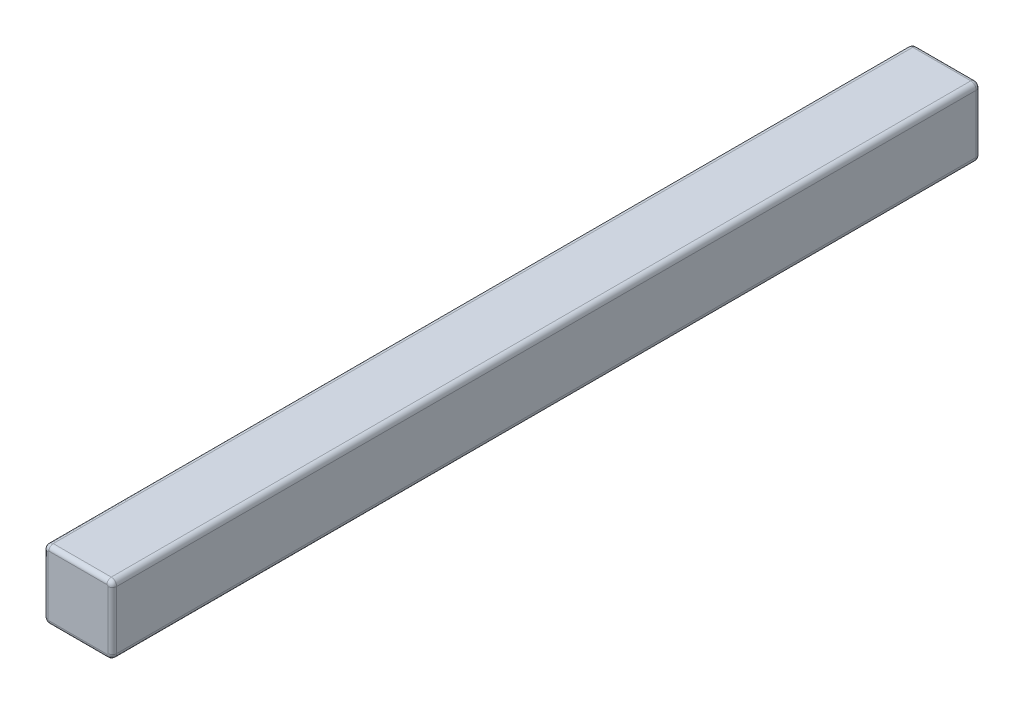
ISO-10303-21;
HEADER;
FILE_DESCRIPTION(('STEP AP214'),'2;1');
FILE_NAME('part.step','',(''),(''),'','','');
FILE_SCHEMA(('AUTOMOTIVE_DESIGN { 1 0 10303 214 1 1 1 1 }'));
ENDSEC;
DATA;
#1=APPLICATION_CONTEXT('core data for automotive mechanical design processes');
#2=APPLICATION_PROTOCOL_DEFINITION('international standard','automotive_design',2000,#1);
#3=PRODUCT_CONTEXT('',#1,'mechanical');
#4=PRODUCT('Part','Part','',(#3));
#5=PRODUCT_RELATED_PRODUCT_CATEGORY('part','',(#4));
#6=PRODUCT_DEFINITION_FORMATION('','',#4);
#7=PRODUCT_DEFINITION_CONTEXT('part definition',#1,'design');
#8=PRODUCT_DEFINITION('design','',#6,#7);
#9=PRODUCT_DEFINITION_SHAPE('','',#8);
#10=(LENGTH_UNIT() NAMED_UNIT(*) SI_UNIT(.MILLI.,.METRE.));
#11=(NAMED_UNIT(*) PLANE_ANGLE_UNIT() SI_UNIT($,.RADIAN.));
#12=(NAMED_UNIT(*) SI_UNIT($,.STERADIAN.) SOLID_ANGLE_UNIT());
#13=UNCERTAINTY_MEASURE_WITH_UNIT(LENGTH_MEASURE(1.E-05),#10,'distance_accuracy_value','');
#14=(GEOMETRIC_REPRESENTATION_CONTEXT(3) GLOBAL_UNCERTAINTY_ASSIGNED_CONTEXT((#13)) GLOBAL_UNIT_ASSIGNED_CONTEXT((#10,
#11,#12)) REPRESENTATION_CONTEXT('',''));
#15=CARTESIAN_POINT('',(0.,0.,0.));
#16=DIRECTION('',(0.,0.,1.));
#17=DIRECTION('',(1.,0.,0.));
#18=AXIS2_PLACEMENT_3D('',#15,#16,#17);
#19=CARTESIAN_POINT('',(-1.3375,1.3375,40.));
#20=DIRECTION('',(0.,0.,-1.));
#21=DIRECTION('',(-1.,0.,0.));
#22=AXIS2_PLACEMENT_3D('',#19,#20,#21);
#23=CYLINDRICAL_SURFACE('',#22,0.25);
#24=DIRECTION('',(0.,0.,-1.));
#25=VECTOR('',#24,1.);
#26=CARTESIAN_POINT('',(-1.3375,1.5875,40.));
#27=LINE('',#26,#25);
#28=CARTESIAN_POINT('',(-1.3375,1.5875,39.8));
#29=VERTEX_POINT('',#28);
#30=CARTESIAN_POINT('',(-1.3375,1.5875,0.199999999999999));
#31=VERTEX_POINT('',#30);
#32=EDGE_CURVE('E267',#29,#31,#27,.T.);
#33=ORIENTED_EDGE('',*,*,#32,.T.);
#34=CARTESIAN_POINT('',(-1.3375,1.3375,0.199999999999999));
#35=DIRECTION('',(0.,0.,1.));
#36=DIRECTION('',(1.,0.,0.));
#37=AXIS2_PLACEMENT_3D('',#34,#35,#36);
#38=CIRCLE('',#37,0.25);
#39=CARTESIAN_POINT('',(-1.5875,1.3375,0.199999999999999));
#40=VERTEX_POINT('',#39);
#41=EDGE_CURVE('E232',#31,#40,#38,.T.);
#42=ORIENTED_EDGE('',*,*,#41,.T.);
#43=DIRECTION('',(0.,0.,-1.));
#44=VECTOR('',#43,1.);
#45=CARTESIAN_POINT('',(-1.5875,1.3375,40.));
#46=LINE('',#45,#44);
#47=CARTESIAN_POINT('',(-1.5875,1.3375,39.8));
#48=VERTEX_POINT('',#47);
#49=EDGE_CURVE('E171',#48,#40,#46,.T.);
#50=ORIENTED_EDGE('',*,*,#49,.F.);
#51=CARTESIAN_POINT('',(-1.3375,1.3375,39.8));
#52=DIRECTION('',(0.,0.,1.));
#53=DIRECTION('',(1.,0.,0.));
#54=AXIS2_PLACEMENT_3D('',#51,#52,#53);
#55=CIRCLE('',#54,0.25);
#56=EDGE_CURVE('E230',#48,#29,#55,.F.);
#57=ORIENTED_EDGE('',*,*,#56,.T.);
#58=EDGE_LOOP('',(#33,#42,#50,#57));
#59=FACE_BOUND('',#58,.T.);
#60=ADVANCED_FACE('F35',(#59),#23,.T.);
#61=CARTESIAN_POINT('',(-1.5875,1.3375,40.));
#62=DIRECTION('',(1.,0.,0.));
#63=DIRECTION('',(0.,0.,-1.));
#64=AXIS2_PLACEMENT_3D('',#61,#62,#63);
#65=PLANE('',#64);
#66=ORIENTED_EDGE('',*,*,#49,.T.);
#67=DIRECTION('',(0.,-1.,0.));
#68=VECTOR('',#67,1.);
#69=CARTESIAN_POINT('',(-1.5875,1.3375,0.199999999999999));
#70=LINE('',#69,#68);
#71=CARTESIAN_POINT('',(-1.5875,-1.3375,0.199999999999999));
#72=VERTEX_POINT('',#71);
#73=EDGE_CURVE('E170',#40,#72,#70,.T.);
#74=ORIENTED_EDGE('',*,*,#73,.T.);
#75=DIRECTION('',(0.,0.,-1.));
#76=VECTOR('',#75,1.);
#77=CARTESIAN_POINT('',(-1.5875,-1.3375,40.));
#78=LINE('',#77,#76);
#79=CARTESIAN_POINT('',(-1.5875,-1.3375,39.8));
#80=VERTEX_POINT('',#79);
#81=EDGE_CURVE('E152',#80,#72,#78,.T.);
#82=ORIENTED_EDGE('',*,*,#81,.F.);
#83=DIRECTION('',(0.,-1.,0.));
#84=VECTOR('',#83,1.);
#85=CARTESIAN_POINT('',(-1.5875,1.3375,39.8));
#86=LINE('',#85,#84);
#87=EDGE_CURVE('E167',#80,#48,#86,.F.);
#88=ORIENTED_EDGE('',*,*,#87,.T.);
#89=EDGE_LOOP('',(#66,#74,#82,#88));
#90=FACE_BOUND('',#89,.T.);
#91=ADVANCED_FACE('F165',(#90),#65,.F.);
#92=CARTESIAN_POINT('',(-1.3375,-1.3375,40.));
#93=DIRECTION('',(0.,0.,-1.));
#94=DIRECTION('',(-1.,0.,0.));
#95=AXIS2_PLACEMENT_3D('',#92,#93,#94);
#96=CYLINDRICAL_SURFACE('',#95,0.25);
#97=ORIENTED_EDGE('',*,*,#81,.T.);
#98=CARTESIAN_POINT('',(-1.3375,-1.3375,0.199999999999999));
#99=DIRECTION('',(0.,0.,1.));
#100=DIRECTION('',(1.,0.,0.));
#101=AXIS2_PLACEMENT_3D('',#98,#99,#100);
#102=CIRCLE('',#101,0.25);
#103=CARTESIAN_POINT('',(-1.3375,-1.5875,0.199999999999999));
#104=VERTEX_POINT('',#103);
#105=EDGE_CURVE('E159',#72,#104,#102,.T.);
#106=ORIENTED_EDGE('',*,*,#105,.T.);
#107=DIRECTION('',(0.,0.,-1.));
#108=VECTOR('',#107,1.);
#109=CARTESIAN_POINT('',(-1.3375,-1.5875,40.));
#110=LINE('',#109,#108);
#111=CARTESIAN_POINT('',(-1.3375,-1.5875,39.8));
#112=VERTEX_POINT('',#111);
#113=EDGE_CURVE('E154',#112,#104,#110,.T.);
#114=ORIENTED_EDGE('',*,*,#113,.F.);
#115=CARTESIAN_POINT('',(-1.3375,-1.3375,39.8));
#116=DIRECTION('',(0.,0.,1.));
#117=DIRECTION('',(1.,0.,0.));
#118=AXIS2_PLACEMENT_3D('',#115,#116,#117);
#119=CIRCLE('',#118,0.25);
#120=EDGE_CURVE('E149',#112,#80,#119,.F.);
#121=ORIENTED_EDGE('',*,*,#120,.T.);
#122=EDGE_LOOP('',(#97,#106,#114,#121));
#123=FACE_BOUND('',#122,.T.);
#124=ADVANCED_FACE('F151',(#123),#96,.T.);
#125=CARTESIAN_POINT('',(-1.3375,-1.5875,40.));
#126=DIRECTION('',(0.,1.,0.));
#127=DIRECTION('',(-1.,0.,0.));
#128=AXIS2_PLACEMENT_3D('',#125,#126,#127);
#129=PLANE('',#128);
#130=ORIENTED_EDGE('',*,*,#113,.T.);
#131=DIRECTION('',(1.,0.,0.));
#132=VECTOR('',#131,1.);
#133=CARTESIAN_POINT('',(-1.3375,-1.5875,0.199999999999999));
#134=LINE('',#133,#132);
#135=CARTESIAN_POINT('',(1.3375,-1.5875,0.199999999999999));
#136=VERTEX_POINT('',#135);
#137=EDGE_CURVE('E211',#104,#136,#134,.T.);
#138=ORIENTED_EDGE('',*,*,#137,.T.);
#139=DIRECTION('',(0.,0.,-1.));
#140=VECTOR('',#139,1.);
#141=CARTESIAN_POINT('',(1.3375,-1.5875,40.));
#142=LINE('',#141,#140);
#143=CARTESIAN_POINT('',(1.3375,-1.5875,39.8));
#144=VERTEX_POINT('',#143);
#145=EDGE_CURVE('E311',#144,#136,#142,.T.);
#146=ORIENTED_EDGE('',*,*,#145,.F.);
#147=DIRECTION('',(1.,0.,0.));
#148=VECTOR('',#147,1.);
#149=CARTESIAN_POINT('',(-1.3375,-1.5875,39.8));
#150=LINE('',#149,#148);
#151=EDGE_CURVE('E209',#144,#112,#150,.F.);
#152=ORIENTED_EDGE('',*,*,#151,.T.);
#153=EDGE_LOOP('',(#130,#138,#146,#152));
#154=FACE_BOUND('',#153,.T.);
#155=ADVANCED_FACE('F316',(#154),#129,.F.);
#156=CARTESIAN_POINT('',(1.3375,-1.3375,40.));
#157=DIRECTION('',(0.,0.,-1.));
#158=DIRECTION('',(-1.,0.,0.));
#159=AXIS2_PLACEMENT_3D('',#156,#157,#158);
#160=CYLINDRICAL_SURFACE('',#159,0.25);
#161=ORIENTED_EDGE('',*,*,#145,.T.);
#162=CARTESIAN_POINT('',(1.3375,-1.3375,0.199999999999999));
#163=DIRECTION('',(0.,0.,1.));
#164=DIRECTION('',(1.,0.,0.));
#165=AXIS2_PLACEMENT_3D('',#162,#163,#164);
#166=CIRCLE('',#165,0.25);
#167=CARTESIAN_POINT('',(1.5875,-1.3375,0.199999999999999));
#168=VERTEX_POINT('',#167);
#169=EDGE_CURVE('E215',#136,#168,#166,.T.);
#170=ORIENTED_EDGE('',*,*,#169,.T.);
#171=DIRECTION('',(0.,0.,-1.));
#172=VECTOR('',#171,1.);
#173=CARTESIAN_POINT('',(1.5875,-1.3375,40.));
#174=LINE('',#173,#172);
#175=CARTESIAN_POINT('',(1.5875,-1.3375,39.8));
#176=VERTEX_POINT('',#175);
#177=EDGE_CURVE('E308',#176,#168,#174,.T.);
#178=ORIENTED_EDGE('',*,*,#177,.F.);
#179=CARTESIAN_POINT('',(1.3375,-1.3375,39.8));
#180=DIRECTION('',(0.,0.,1.));
#181=DIRECTION('',(1.,0.,0.));
#182=AXIS2_PLACEMENT_3D('',#179,#180,#181);
#183=CIRCLE('',#182,0.25);
#184=EDGE_CURVE('E213',#176,#144,#183,.F.);
#185=ORIENTED_EDGE('',*,*,#184,.T.);
#186=EDGE_LOOP('',(#161,#170,#178,#185));
#187=FACE_BOUND('',#186,.T.);
#188=ADVANCED_FACE('F358',(#187),#160,.T.);
#189=CARTESIAN_POINT('',(1.5875,1.3375,40.));
#190=DIRECTION('',(1.,0.,0.));
#191=DIRECTION('',(0.,1.,0.));
#192=AXIS2_PLACEMENT_3D('',#189,#190,#191);
#193=PLANE('',#192);
#194=ORIENTED_EDGE('',*,*,#177,.T.);
#195=DIRECTION('',(0.,-1.,0.));
#196=VECTOR('',#195,1.);
#197=CARTESIAN_POINT('',(1.5875,1.3375,0.2));
#198=LINE('',#197,#196);
#199=CARTESIAN_POINT('',(1.5875,1.3375,0.199999999999999));
#200=VERTEX_POINT('',#199);
#201=EDGE_CURVE('E219',#168,#200,#198,.F.);
#202=ORIENTED_EDGE('',*,*,#201,.T.);
#203=DIRECTION('',(0.,0.,-1.));
#204=VECTOR('',#203,1.);
#205=CARTESIAN_POINT('',(1.5875,1.3375,40.));
#206=LINE('',#205,#204);
#207=CARTESIAN_POINT('',(1.5875,1.3375,39.8));
#208=VERTEX_POINT('',#207);
#209=EDGE_CURVE('E303',#208,#200,#206,.T.);
#210=ORIENTED_EDGE('',*,*,#209,.F.);
#211=DIRECTION('',(0.,-1.,0.));
#212=VECTOR('',#211,1.);
#213=CARTESIAN_POINT('',(1.5875,1.3375,39.8));
#214=LINE('',#213,#212);
#215=EDGE_CURVE('E217',#208,#176,#214,.T.);
#216=ORIENTED_EDGE('',*,*,#215,.T.);
#217=EDGE_LOOP('',(#194,#202,#210,#216));
#218=FACE_BOUND('',#217,.T.);
#219=ADVANCED_FACE('F360',(#218),#193,.T.);
#220=CARTESIAN_POINT('',(1.3375,1.3375,40.));
#221=DIRECTION('',(0.,0.,-1.));
#222=DIRECTION('',(-1.,0.,0.));
#223=AXIS2_PLACEMENT_3D('',#220,#221,#222);
#224=CYLINDRICAL_SURFACE('',#223,0.25);
#225=ORIENTED_EDGE('',*,*,#209,.T.);
#226=CARTESIAN_POINT('',(1.3375,1.3375,0.199999999999999));
#227=DIRECTION('',(0.,0.,1.));
#228=DIRECTION('',(1.,0.,0.));
#229=AXIS2_PLACEMENT_3D('',#226,#227,#228);
#230=CIRCLE('',#229,0.25);
#231=CARTESIAN_POINT('',(1.3375,1.5875,0.199999999999999));
#232=VERTEX_POINT('',#231);
#233=EDGE_CURVE('E223',#200,#232,#230,.T.);
#234=ORIENTED_EDGE('',*,*,#233,.T.);
#235=DIRECTION('',(0.,0.,-1.));
#236=VECTOR('',#235,1.);
#237=CARTESIAN_POINT('',(1.3375,1.5875,40.));
#238=LINE('',#237,#236);
#239=CARTESIAN_POINT('',(1.3375,1.5875,39.8));
#240=VERTEX_POINT('',#239);
#241=EDGE_CURVE('E301',#240,#232,#238,.T.);
#242=ORIENTED_EDGE('',*,*,#241,.F.);
#243=CARTESIAN_POINT('',(1.3375,1.3375,39.8));
#244=DIRECTION('',(0.,0.,1.));
#245=DIRECTION('',(1.,0.,0.));
#246=AXIS2_PLACEMENT_3D('',#243,#244,#245);
#247=CIRCLE('',#246,0.25);
#248=EDGE_CURVE('E221',#240,#208,#247,.F.);
#249=ORIENTED_EDGE('',*,*,#248,.T.);
#250=EDGE_LOOP('',(#225,#234,#242,#249));
#251=FACE_BOUND('',#250,.T.);
#252=ADVANCED_FACE('F411',(#251),#224,.T.);
#253=CARTESIAN_POINT('',(-1.3375,1.5875,40.));
#254=DIRECTION('',(0.,1.,0.));
#255=DIRECTION('',(-1.,0.,0.));
#256=AXIS2_PLACEMENT_3D('',#253,#254,#255);
#257=PLANE('',#256);
#258=ORIENTED_EDGE('',*,*,#241,.T.);
#259=DIRECTION('',(1.,0.,0.));
#260=VECTOR('',#259,1.);
#261=CARTESIAN_POINT('',(-1.3375,1.5875,0.2));
#262=LINE('',#261,#260);
#263=EDGE_CURVE('E228',#232,#31,#262,.F.);
#264=ORIENTED_EDGE('',*,*,#263,.T.);
#265=ORIENTED_EDGE('',*,*,#32,.F.);
#266=DIRECTION('',(1.,0.,0.));
#267=VECTOR('',#266,1.);
#268=CARTESIAN_POINT('',(-1.3375,1.5875,39.8));
#269=LINE('',#268,#267);
#270=EDGE_CURVE('E225',#29,#240,#269,.T.);
#271=ORIENTED_EDGE('',*,*,#270,.T.);
#272=EDGE_LOOP('',(#258,#264,#265,#271));
#273=FACE_BOUND('',#272,.T.);
#274=ADVANCED_FACE('F298',(#273),#257,.T.);
#275=CARTESIAN_POINT('',(-1.3375,1.3375,40.));
#276=DIRECTION('',(0.,0.,1.));
#277=DIRECTION('',(1.,0.,0.));
#278=AXIS2_PLACEMENT_3D('',#275,#276,#277);
#279=PLANE('',#278);
#280=CARTESIAN_POINT('',(1.3375,1.3375,40.));
#281=DIRECTION('',(0.,0.,1.));
#282=DIRECTION('',(1.,0.,0.));
#283=AXIS2_PLACEMENT_3D('',#280,#281,#282);
#284=CIRCLE('',#283,0.0499999999999999);
#285=CARTESIAN_POINT('',(1.3875,1.3375,40.));
#286=VERTEX_POINT('',#285);
#287=CARTESIAN_POINT('',(1.3375,1.3875,40.));
#288=VERTEX_POINT('',#287);
#289=EDGE_CURVE('E44',#286,#288,#284,.T.);
#290=ORIENTED_EDGE('',*,*,#289,.T.);
#291=DIRECTION('',(1.,0.,0.));
#292=VECTOR('',#291,1.);
#293=CARTESIAN_POINT('',(-1.3375,1.3875,40.));
#294=LINE('',#293,#292);
#295=CARTESIAN_POINT('',(-1.3375,1.3875,40.));
#296=VERTEX_POINT('',#295);
#297=EDGE_CURVE('E11',#288,#296,#294,.F.);
#298=ORIENTED_EDGE('',*,*,#297,.T.);
#299=CARTESIAN_POINT('',(-1.3375,1.3375,40.));
#300=DIRECTION('',(0.,0.,1.));
#301=DIRECTION('',(1.,0.,0.));
#302=AXIS2_PLACEMENT_3D('',#299,#300,#301);
#303=CIRCLE('',#302,0.0500000000000001);
#304=CARTESIAN_POINT('',(-1.3875,1.3375,40.));
#305=VERTEX_POINT('',#304);
#306=EDGE_CURVE('E234',#296,#305,#303,.T.);
#307=ORIENTED_EDGE('',*,*,#306,.T.);
#308=DIRECTION('',(0.,-1.,0.));
#309=VECTOR('',#308,1.);
#310=CARTESIAN_POINT('',(-1.3875,-1.3375,40.));
#311=LINE('',#310,#309);
#312=CARTESIAN_POINT('',(-1.3875,-1.3375,40.));
#313=VERTEX_POINT('',#312);
#314=EDGE_CURVE('E236',#305,#313,#311,.T.);
#315=ORIENTED_EDGE('',*,*,#314,.T.);
#316=CARTESIAN_POINT('',(-1.3375,-1.3375,40.));
#317=DIRECTION('',(0.,0.,1.));
#318=DIRECTION('',(1.,0.,0.));
#319=AXIS2_PLACEMENT_3D('',#316,#317,#318);
#320=CIRCLE('',#319,0.05);
#321=CARTESIAN_POINT('',(-1.3375,-1.3875,40.));
#322=VERTEX_POINT('',#321);
#323=EDGE_CURVE('E177',#313,#322,#320,.T.);
#324=ORIENTED_EDGE('',*,*,#323,.T.);
#325=DIRECTION('',(1.,0.,0.));
#326=VECTOR('',#325,1.);
#327=CARTESIAN_POINT('',(1.3375,-1.3875,40.));
#328=LINE('',#327,#326);
#329=CARTESIAN_POINT('',(1.3375,-1.3875,40.));
#330=VERTEX_POINT('',#329);
#331=EDGE_CURVE('E239',#322,#330,#328,.T.);
#332=ORIENTED_EDGE('',*,*,#331,.T.);
#333=CARTESIAN_POINT('',(1.3375,-1.3375,40.));
#334=DIRECTION('',(0.,0.,1.));
#335=DIRECTION('',(1.,0.,0.));
#336=AXIS2_PLACEMENT_3D('',#333,#334,#335);
#337=CIRCLE('',#336,0.0499999999999997);
#338=CARTESIAN_POINT('',(1.3875,-1.3375,40.));
#339=VERTEX_POINT('',#338);
#340=EDGE_CURVE('E241',#330,#339,#337,.T.);
#341=ORIENTED_EDGE('',*,*,#340,.T.);
#342=DIRECTION('',(0.,-1.,0.));
#343=VECTOR('',#342,1.);
#344=CARTESIAN_POINT('',(1.3875,1.3375,40.));
#345=LINE('',#344,#343);
#346=EDGE_CURVE('E55',#339,#286,#345,.F.);
#347=ORIENTED_EDGE('',*,*,#346,.T.);
#348=EDGE_LOOP('',(#290,#298,#307,#315,#324,#332,#341,#347));
#349=FACE_BOUND('',#348,.T.);
#350=ADVANCED_FACE('F285',(#349),#279,.T.);
#351=CARTESIAN_POINT('',(-1.3375,1.3375,0.));
#352=DIRECTION('',(0.,0.,1.));
#353=DIRECTION('',(1.,0.,0.));
#354=AXIS2_PLACEMENT_3D('',#351,#352,#353);
#355=PLANE('',#354);
#356=CARTESIAN_POINT('',(-1.3375,-1.3375,0.));
#357=DIRECTION('',(0.,0.,1.));
#358=DIRECTION('',(1.,0.,0.));
#359=AXIS2_PLACEMENT_3D('',#356,#357,#358);
#360=CIRCLE('',#359,0.05);
#361=CARTESIAN_POINT('',(-1.3375,-1.3875,0.));
#362=VERTEX_POINT('',#361);
#363=CARTESIAN_POINT('',(-1.3875,-1.3375,0.));
#364=VERTEX_POINT('',#363);
#365=EDGE_CURVE('E204',#362,#364,#360,.F.);
#366=ORIENTED_EDGE('',*,*,#365,.T.);
#367=DIRECTION('',(0.,-1.,0.));
#368=VECTOR('',#367,1.);
#369=CARTESIAN_POINT('',(-1.3875,1.3375,0.));
#370=LINE('',#369,#368);
#371=CARTESIAN_POINT('',(-1.3875,1.3375,0.));
#372=VERTEX_POINT('',#371);
#373=EDGE_CURVE('E160',#364,#372,#370,.F.);
#374=ORIENTED_EDGE('',*,*,#373,.T.);
#375=CARTESIAN_POINT('',(-1.3375,1.3375,0.));
#376=DIRECTION('',(0.,0.,1.));
#377=DIRECTION('',(1.,0.,0.));
#378=AXIS2_PLACEMENT_3D('',#375,#376,#377);
#379=CIRCLE('',#378,0.0500000000000001);
#380=CARTESIAN_POINT('',(-1.3375,1.3875,0.));
#381=VERTEX_POINT('',#380);
#382=EDGE_CURVE('E189',#372,#381,#379,.F.);
#383=ORIENTED_EDGE('',*,*,#382,.T.);
#384=DIRECTION('',(1.,0.,0.));
#385=VECTOR('',#384,1.);
#386=CARTESIAN_POINT('',(1.3375,1.3875,0.));
#387=LINE('',#386,#385);
#388=CARTESIAN_POINT('',(1.3375,1.3875,0.));
#389=VERTEX_POINT('',#388);
#390=EDGE_CURVE('E194',#381,#389,#387,.T.);
#391=ORIENTED_EDGE('',*,*,#390,.T.);
#392=CARTESIAN_POINT('',(1.3375,1.3375,0.));
#393=DIRECTION('',(0.,0.,1.));
#394=DIRECTION('',(1.,0.,0.));
#395=AXIS2_PLACEMENT_3D('',#392,#393,#394);
#396=CIRCLE('',#395,0.0499999999999999);
#397=CARTESIAN_POINT('',(1.3875,1.3375,0.));
#398=VERTEX_POINT('',#397);
#399=EDGE_CURVE('E196',#389,#398,#396,.F.);
#400=ORIENTED_EDGE('',*,*,#399,.T.);
#401=DIRECTION('',(0.,-1.,0.));
#402=VECTOR('',#401,1.);
#403=CARTESIAN_POINT('',(1.3875,-1.3375,0.));
#404=LINE('',#403,#402);
#405=CARTESIAN_POINT('',(1.3875,-1.3375,0.));
#406=VERTEX_POINT('',#405);
#407=EDGE_CURVE('E198',#398,#406,#404,.T.);
#408=ORIENTED_EDGE('',*,*,#407,.T.);
#409=CARTESIAN_POINT('',(1.3375,-1.3375,0.));
#410=DIRECTION('',(0.,0.,1.));
#411=DIRECTION('',(1.,0.,0.));
#412=AXIS2_PLACEMENT_3D('',#409,#410,#411);
#413=CIRCLE('',#412,0.0499999999999997);
#414=CARTESIAN_POINT('',(1.3375,-1.3875,0.));
#415=VERTEX_POINT('',#414);
#416=EDGE_CURVE('E200',#406,#415,#413,.F.);
#417=ORIENTED_EDGE('',*,*,#416,.T.);
#418=DIRECTION('',(1.,0.,0.));
#419=VECTOR('',#418,1.);
#420=CARTESIAN_POINT('',(-1.3375,-1.3875,0.));
#421=LINE('',#420,#419);
#422=EDGE_CURVE('E202',#415,#362,#421,.F.);
#423=ORIENTED_EDGE('',*,*,#422,.T.);
#424=EDGE_LOOP('',(#366,#374,#383,#391,#400,#408,#417,#423));
#425=FACE_BOUND('',#424,.T.);
#426=ADVANCED_FACE('F330',(#425),#355,.F.);
#427=CARTESIAN_POINT('',(1.3875,1.3375,0.2));
#428=DIRECTION('',(0.,1.,0.));
#429=DIRECTION('',(-1.,0.,0.));
#430=AXIS2_PLACEMENT_3D('',#427,#428,#429);
#431=CYLINDRICAL_SURFACE('',#430,0.2);
#432=CARTESIAN_POINT('',(1.3875,-1.3375,0.2));
#433=DIRECTION('',(0.,-1.,0.));
#434=DIRECTION('',(0.,0.,-1.));
#435=AXIS2_PLACEMENT_3D('',#432,#433,#434);
#436=CIRCLE('',#435,0.2);
#437=EDGE_CURVE('E261',#406,#168,#436,.T.);
#438=ORIENTED_EDGE('',*,*,#437,.F.);
#439=ORIENTED_EDGE('',*,*,#407,.F.);
#440=CARTESIAN_POINT('',(1.3875,1.3375,0.2));
#441=DIRECTION('',(0.,1.,0.));
#442=DIRECTION('',(0.,0.,1.));
#443=AXIS2_PLACEMENT_3D('',#440,#441,#442);
#444=CIRCLE('',#443,0.2);
#445=EDGE_CURVE('E264',#200,#398,#444,.T.);
#446=ORIENTED_EDGE('',*,*,#445,.F.);
#447=ORIENTED_EDGE('',*,*,#201,.F.);
#448=EDGE_LOOP('',(#438,#439,#446,#447));
#449=FACE_BOUND('',#448,.T.);
#450=ADVANCED_FACE('F350',(#449),#431,.T.);
#451=CARTESIAN_POINT('',(1.3375,1.3375,0.199999999999999));
#452=DIRECTION('',(0.,0.,1.));
#453=DIRECTION('',(1.,0.,0.));
#454=AXIS2_PLACEMENT_3D('',#451,#452,#453);
#455=DEGENERATE_TOROIDAL_SURFACE('',#454,0.0499999999999999,0.2,.T.);
#456=ORIENTED_EDGE('',*,*,#445,.T.);
#457=ORIENTED_EDGE('',*,*,#399,.F.);
#458=CARTESIAN_POINT('',(1.3375,1.3875,0.199999999999999));
#459=DIRECTION('',(-1.,0.,0.));
#460=DIRECTION('',(0.,-1.,0.));
#461=AXIS2_PLACEMENT_3D('',#458,#459,#460);
#462=CIRCLE('',#461,0.2);
#463=EDGE_CURVE('E258',#232,#389,#462,.T.);
#464=ORIENTED_EDGE('',*,*,#463,.F.);
#465=ORIENTED_EDGE('',*,*,#233,.F.);
#466=EDGE_LOOP('',(#456,#457,#464,#465));
#467=FACE_BOUND('',#466,.T.);
#468=ADVANCED_FACE('F345',(#467),#455,.T.);
#469=CARTESIAN_POINT('',(1.3375,-1.3375,0.199999999999999));
#470=DIRECTION('',(0.,0.,1.));
#471=DIRECTION('',(1.,0.,0.));
#472=AXIS2_PLACEMENT_3D('',#469,#470,#471);
#473=DEGENERATE_TOROIDAL_SURFACE('',#472,0.0499999999999997,0.2,.T.);
#474=ORIENTED_EDGE('',*,*,#437,.T.);
#475=ORIENTED_EDGE('',*,*,#169,.F.);
#476=CARTESIAN_POINT('',(1.3375,-1.3875,0.2));
#477=DIRECTION('',(-1.,0.,0.));
#478=DIRECTION('',(0.,0.,1.));
#479=AXIS2_PLACEMENT_3D('',#476,#477,#478);
#480=CIRCLE('',#479,0.2);
#481=EDGE_CURVE('E255',#415,#136,#480,.T.);
#482=ORIENTED_EDGE('',*,*,#481,.F.);
#483=ORIENTED_EDGE('',*,*,#416,.F.);
#484=EDGE_LOOP('',(#474,#475,#482,#483));
#485=FACE_BOUND('',#484,.T.);
#486=ADVANCED_FACE('F355',(#485),#473,.T.);
#487=CARTESIAN_POINT('',(-1.3375,1.3875,0.2));
#488=DIRECTION('',(-1.,0.,0.));
#489=DIRECTION('',(0.,-1.,0.));
#490=AXIS2_PLACEMENT_3D('',#487,#488,#489);
#491=CYLINDRICAL_SURFACE('',#490,0.2);
#492=ORIENTED_EDGE('',*,*,#463,.T.);
#493=ORIENTED_EDGE('',*,*,#390,.F.);
#494=CARTESIAN_POINT('',(-1.3375,1.3875,0.2));
#495=DIRECTION('',(-1.,0.,0.));
#496=DIRECTION('',(0.,0.,1.));
#497=AXIS2_PLACEMENT_3D('',#494,#495,#496);
#498=CIRCLE('',#497,0.2);
#499=EDGE_CURVE('E252',#31,#381,#498,.T.);
#500=ORIENTED_EDGE('',*,*,#499,.F.);
#501=ORIENTED_EDGE('',*,*,#263,.F.);
#502=EDGE_LOOP('',(#492,#493,#500,#501));
#503=FACE_BOUND('',#502,.T.);
#504=ADVANCED_FACE('F341',(#503),#491,.T.);
#505=CARTESIAN_POINT('',(-1.3375,-1.3875,0.199999999999999));
#506=DIRECTION('',(1.,0.,0.));
#507=DIRECTION('',(0.,1.,0.));
#508=AXIS2_PLACEMENT_3D('',#505,#506,#507);
#509=CYLINDRICAL_SURFACE('',#508,0.2);
#510=ORIENTED_EDGE('',*,*,#481,.T.);
#511=ORIENTED_EDGE('',*,*,#137,.F.);
#512=CARTESIAN_POINT('',(-1.3375,-1.3875,0.2));
#513=DIRECTION('',(-1.,0.,0.));
#514=DIRECTION('',(0.,-1.,0.));
#515=AXIS2_PLACEMENT_3D('',#512,#513,#514);
#516=CIRCLE('',#515,0.2);
#517=EDGE_CURVE('E249',#362,#104,#516,.T.);
#518=ORIENTED_EDGE('',*,*,#517,.F.);
#519=ORIENTED_EDGE('',*,*,#422,.F.);
#520=EDGE_LOOP('',(#510,#511,#518,#519));
#521=FACE_BOUND('',#520,.T.);
#522=ADVANCED_FACE('F320',(#521),#509,.T.);
#523=CARTESIAN_POINT('',(-1.3375,1.3375,0.199999999999999));
#524=DIRECTION('',(0.,0.,1.));
#525=DIRECTION('',(1.,0.,0.));
#526=AXIS2_PLACEMENT_3D('',#523,#524,#525);
#527=DEGENERATE_TOROIDAL_SURFACE('',#526,0.0500000000000001,0.2,.T.);
#528=ORIENTED_EDGE('',*,*,#499,.T.);
#529=ORIENTED_EDGE('',*,*,#382,.F.);
#530=CARTESIAN_POINT('',(-1.3875,1.3375,0.199999999999999));
#531=DIRECTION('',(0.,-1.,0.));
#532=DIRECTION('',(0.,0.,-1.));
#533=AXIS2_PLACEMENT_3D('',#530,#531,#532);
#534=CIRCLE('',#533,0.2);
#535=EDGE_CURVE('E247',#40,#372,#534,.T.);
#536=ORIENTED_EDGE('',*,*,#535,.F.);
#537=ORIENTED_EDGE('',*,*,#41,.F.);
#538=EDGE_LOOP('',(#528,#529,#536,#537));
#539=FACE_BOUND('',#538,.T.);
#540=ADVANCED_FACE('F337',(#539),#527,.T.);
#541=CARTESIAN_POINT('',(-1.3375,-1.3375,0.199999999999999));
#542=DIRECTION('',(0.,0.,1.));
#543=DIRECTION('',(1.,0.,0.));
#544=AXIS2_PLACEMENT_3D('',#541,#542,#543);
#545=DEGENERATE_TOROIDAL_SURFACE('',#544,0.05,0.2,.T.);
#546=ORIENTED_EDGE('',*,*,#517,.T.);
#547=ORIENTED_EDGE('',*,*,#105,.F.);
#548=CARTESIAN_POINT('',(-1.3875,-1.3375,0.2));
#549=DIRECTION('',(0.,1.,0.));
#550=DIRECTION('',(0.,0.,1.));
#551=AXIS2_PLACEMENT_3D('',#548,#549,#550);
#552=CIRCLE('',#551,0.2);
#553=EDGE_CURVE('E245',#364,#72,#552,.T.);
#554=ORIENTED_EDGE('',*,*,#553,.F.);
#555=ORIENTED_EDGE('',*,*,#365,.F.);
#556=EDGE_LOOP('',(#546,#547,#554,#555));
#557=FACE_BOUND('',#556,.T.);
#558=ADVANCED_FACE('F326',(#557),#545,.T.);
#559=CARTESIAN_POINT('',(-1.3875,1.3375,0.199999999999999));
#560=DIRECTION('',(0.,-1.,0.));
#561=DIRECTION('',(0.,0.,-1.));
#562=AXIS2_PLACEMENT_3D('',#559,#560,#561);
#563=CYLINDRICAL_SURFACE('',#562,0.2);
#564=ORIENTED_EDGE('',*,*,#535,.T.);
#565=ORIENTED_EDGE('',*,*,#373,.F.);
#566=ORIENTED_EDGE('',*,*,#553,.T.);
#567=ORIENTED_EDGE('',*,*,#73,.F.);
#568=EDGE_LOOP('',(#564,#565,#566,#567));
#569=FACE_BOUND('',#568,.T.);
#570=ADVANCED_FACE('F332',(#569),#563,.T.);
#571=CARTESIAN_POINT('',(-1.3375,-1.3875,39.8));
#572=DIRECTION('',(-1.,0.,0.));
#573=DIRECTION('',(0.,-1.,0.));
#574=AXIS2_PLACEMENT_3D('',#571,#572,#573);
#575=CYLINDRICAL_SURFACE('',#574,0.2);
#576=CARTESIAN_POINT('',(1.3375,-1.3875,39.8));
#577=DIRECTION('',(1.,0.,0.));
#578=DIRECTION('',(0.,0.,-1.));
#579=AXIS2_PLACEMENT_3D('',#576,#577,#578);
#580=CIRCLE('',#579,0.2);
#581=EDGE_CURVE('E180',#330,#144,#580,.T.);
#582=ORIENTED_EDGE('',*,*,#581,.F.);
#583=ORIENTED_EDGE('',*,*,#331,.F.);
#584=CARTESIAN_POINT('',(-1.3375,-1.3875,39.8));
#585=DIRECTION('',(-1.,0.,0.));
#586=DIRECTION('',(0.,0.,1.));
#587=AXIS2_PLACEMENT_3D('',#584,#585,#586);
#588=CIRCLE('',#587,0.2);
#589=EDGE_CURVE('E39',#112,#322,#588,.T.);
#590=ORIENTED_EDGE('',*,*,#589,.F.);
#591=ORIENTED_EDGE('',*,*,#151,.F.);
#592=EDGE_LOOP('',(#582,#583,#590,#591));
#593=FACE_BOUND('',#592,.T.);
#594=ADVANCED_FACE('F37',(#593),#575,.T.);
#595=CARTESIAN_POINT('',(-1.3375,-1.3375,39.8));
#596=DIRECTION('',(0.,0.,1.));
#597=DIRECTION('',(1.,0.,0.));
#598=AXIS2_PLACEMENT_3D('',#595,#596,#597);
#599=DEGENERATE_TOROIDAL_SURFACE('',#598,0.05,0.2,.T.);
#600=ORIENTED_EDGE('',*,*,#589,.T.);
#601=ORIENTED_EDGE('',*,*,#323,.F.);
#602=CARTESIAN_POINT('',(-1.3875,-1.3375,39.8));
#603=DIRECTION('',(0.,1.,0.));
#604=DIRECTION('',(0.,0.,1.));
#605=AXIS2_PLACEMENT_3D('',#602,#603,#604);
#606=CIRCLE('',#605,0.2);
#607=EDGE_CURVE('E175',#80,#313,#606,.T.);
#608=ORIENTED_EDGE('',*,*,#607,.F.);
#609=ORIENTED_EDGE('',*,*,#120,.F.);
#610=EDGE_LOOP('',(#600,#601,#608,#609));
#611=FACE_BOUND('',#610,.T.);
#612=ADVANCED_FACE('F176',(#611),#599,.T.);
#613=CARTESIAN_POINT('',(1.3375,-1.3375,39.8));
#614=DIRECTION('',(0.,0.,1.));
#615=DIRECTION('',(1.,0.,0.));
#616=AXIS2_PLACEMENT_3D('',#613,#614,#615);
#617=DEGENERATE_TOROIDAL_SURFACE('',#616,0.0499999999999997,0.2,.T.);
#618=ORIENTED_EDGE('',*,*,#581,.T.);
#619=ORIENTED_EDGE('',*,*,#184,.F.);
#620=CARTESIAN_POINT('',(1.3875,-1.3375,39.8));
#621=DIRECTION('',(0.,1.,0.));
#622=DIRECTION('',(0.,0.,1.));
#623=AXIS2_PLACEMENT_3D('',#620,#621,#622);
#624=CIRCLE('',#623,0.2);
#625=EDGE_CURVE('E181',#339,#176,#624,.T.);
#626=ORIENTED_EDGE('',*,*,#625,.F.);
#627=ORIENTED_EDGE('',*,*,#340,.F.);
#628=EDGE_LOOP('',(#618,#619,#626,#627));
#629=FACE_BOUND('',#628,.T.);
#630=ADVANCED_FACE('F515',(#629),#617,.T.);
#631=CARTESIAN_POINT('',(-1.3875,1.3375,39.8));
#632=DIRECTION('',(0.,1.,0.));
#633=DIRECTION('',(0.,0.,1.));
#634=AXIS2_PLACEMENT_3D('',#631,#632,#633);
#635=CYLINDRICAL_SURFACE('',#634,0.2);
#636=ORIENTED_EDGE('',*,*,#607,.T.);
#637=ORIENTED_EDGE('',*,*,#314,.F.);
#638=CARTESIAN_POINT('',(-1.3875,1.3375,39.8));
#639=DIRECTION('',(0.,1.,0.));
#640=DIRECTION('',(0.,0.,1.));
#641=AXIS2_PLACEMENT_3D('',#638,#639,#640);
#642=CIRCLE('',#641,0.2);
#643=EDGE_CURVE('E186',#48,#305,#642,.T.);
#644=ORIENTED_EDGE('',*,*,#643,.F.);
#645=ORIENTED_EDGE('',*,*,#87,.F.);
#646=EDGE_LOOP('',(#636,#637,#644,#645));
#647=FACE_BOUND('',#646,.T.);
#648=ADVANCED_FACE('F184',(#647),#635,.T.);
#649=CARTESIAN_POINT('',(1.3875,1.3375,39.8));
#650=DIRECTION('',(0.,-1.,0.));
#651=DIRECTION('',(1.,0.,0.));
#652=AXIS2_PLACEMENT_3D('',#649,#650,#651);
#653=CYLINDRICAL_SURFACE('',#652,0.2);
#654=ORIENTED_EDGE('',*,*,#625,.T.);
#655=ORIENTED_EDGE('',*,*,#215,.F.);
#656=CARTESIAN_POINT('',(1.3875,1.3375,39.8));
#657=DIRECTION('',(0.,1.,0.));
#658=DIRECTION('',(0.,0.,1.));
#659=AXIS2_PLACEMENT_3D('',#656,#657,#658);
#660=CIRCLE('',#659,0.2);
#661=EDGE_CURVE('E272',#286,#208,#660,.T.);
#662=ORIENTED_EDGE('',*,*,#661,.F.);
#663=ORIENTED_EDGE('',*,*,#346,.F.);
#664=EDGE_LOOP('',(#654,#655,#662,#663));
#665=FACE_BOUND('',#664,.T.);
#666=ADVANCED_FACE('F364',(#665),#653,.T.);
#667=CARTESIAN_POINT('',(-1.3375,1.3375,39.8));
#668=DIRECTION('',(0.,0.,1.));
#669=DIRECTION('',(1.,0.,0.));
#670=AXIS2_PLACEMENT_3D('',#667,#668,#669);
#671=DEGENERATE_TOROIDAL_SURFACE('',#670,0.0500000000000001,0.2,.T.);
#672=ORIENTED_EDGE('',*,*,#643,.T.);
#673=ORIENTED_EDGE('',*,*,#306,.F.);
#674=CARTESIAN_POINT('',(-1.3375,1.3875,39.8));
#675=DIRECTION('',(1.,0.,0.));
#676=DIRECTION('',(0.,0.,-1.));
#677=AXIS2_PLACEMENT_3D('',#674,#675,#676);
#678=CIRCLE('',#677,0.2);
#679=EDGE_CURVE('E270',#29,#296,#678,.T.);
#680=ORIENTED_EDGE('',*,*,#679,.F.);
#681=ORIENTED_EDGE('',*,*,#56,.F.);
#682=EDGE_LOOP('',(#672,#673,#680,#681));
#683=FACE_BOUND('',#682,.T.);
#684=ADVANCED_FACE('F289',(#683),#671,.T.);
#685=CARTESIAN_POINT('',(1.3375,1.3375,39.8));
#686=DIRECTION('',(0.,0.,1.));
#687=DIRECTION('',(1.,0.,0.));
#688=AXIS2_PLACEMENT_3D('',#685,#686,#687);
#689=DEGENERATE_TOROIDAL_SURFACE('',#688,0.0499999999999999,0.2,.T.);
#690=ORIENTED_EDGE('',*,*,#661,.T.);
#691=ORIENTED_EDGE('',*,*,#248,.F.);
#692=CARTESIAN_POINT('',(1.3375,1.3875,39.8));
#693=DIRECTION('',(-1.,0.,0.));
#694=DIRECTION('',(0.,0.,1.));
#695=AXIS2_PLACEMENT_3D('',#692,#693,#694);
#696=CIRCLE('',#695,0.2);
#697=EDGE_CURVE('E268',#288,#240,#696,.T.);
#698=ORIENTED_EDGE('',*,*,#697,.F.);
#699=ORIENTED_EDGE('',*,*,#289,.F.);
#700=EDGE_LOOP('',(#690,#691,#698,#699));
#701=FACE_BOUND('',#700,.T.);
#702=ADVANCED_FACE('F367',(#701),#689,.T.);
#703=CARTESIAN_POINT('',(-1.3375,1.3875,39.8));
#704=DIRECTION('',(1.,0.,0.));
#705=DIRECTION('',(0.,1.,0.));
#706=AXIS2_PLACEMENT_3D('',#703,#704,#705);
#707=CYLINDRICAL_SURFACE('',#706,0.2);
#708=ORIENTED_EDGE('',*,*,#679,.T.);
#709=ORIENTED_EDGE('',*,*,#297,.F.);
#710=ORIENTED_EDGE('',*,*,#697,.T.);
#711=ORIENTED_EDGE('',*,*,#270,.F.);
#712=EDGE_LOOP('',(#708,#709,#710,#711));
#713=FACE_BOUND('',#712,.T.);
#714=ADVANCED_FACE('F370',(#713),#707,.T.);
#715=CLOSED_SHELL('',(#60,#91,#124,#155,#188,#219,#252,#274,#350,#426,#450,#468,#486,#504,#522,
#540,#558,#570,#594,#612,#630,#648,#666,#684,#702,#714));
#716=MANIFOLD_SOLID_BREP('B2',#715);
#717=ADVANCED_BREP_SHAPE_REPRESENTATION('',(#18,#716),#14);
#718=SHAPE_DEFINITION_REPRESENTATION(#9,#717);
ENDSEC;
END-ISO-10303-21;
